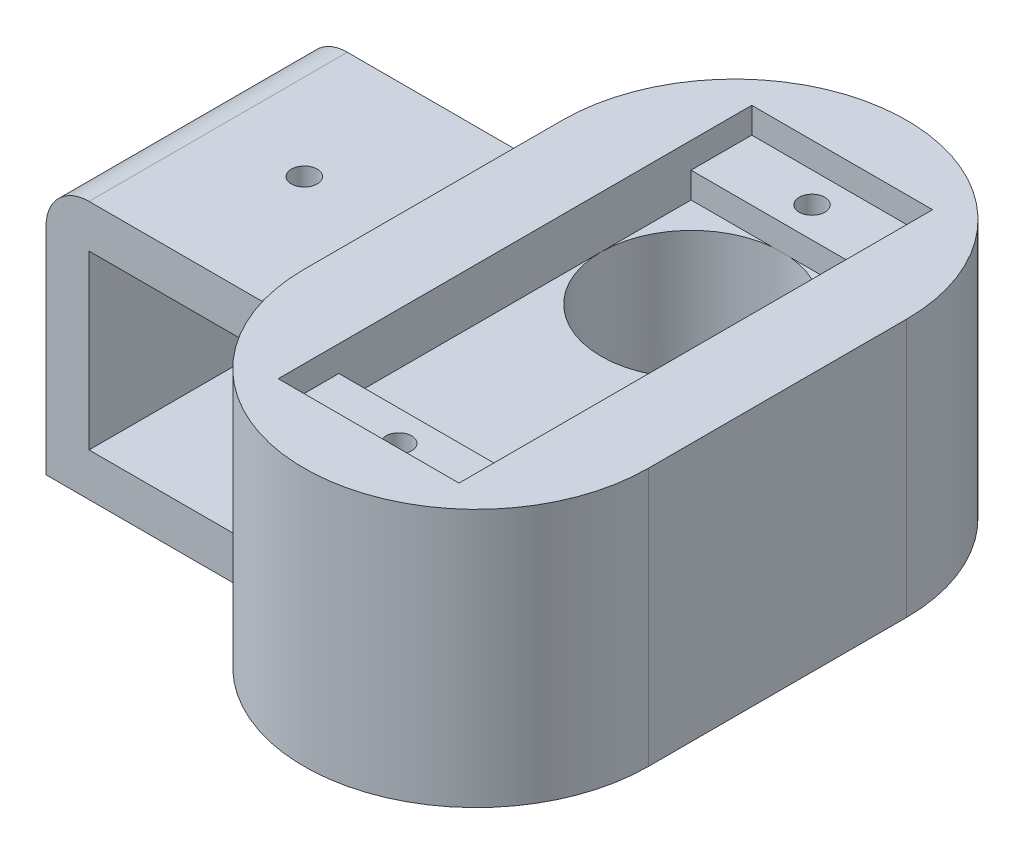
ISO-10303-21;
HEADER;
FILE_DESCRIPTION(('STEP AP214'),'2;1');
FILE_NAME('part.step','',(''),(''),'','','');
FILE_SCHEMA(('AUTOMOTIVE_DESIGN { 1 0 10303 214 1 1 1 1 }'));
ENDSEC;
DATA;
#1=APPLICATION_CONTEXT('core data for automotive mechanical design processes');
#2=APPLICATION_PROTOCOL_DEFINITION('international standard','automotive_design',2000,#1);
#3=PRODUCT_CONTEXT('',#1,'mechanical');
#4=PRODUCT('Part','Part','',(#3));
#5=PRODUCT_RELATED_PRODUCT_CATEGORY('part','',(#4));
#6=PRODUCT_DEFINITION_FORMATION('','',#4);
#7=PRODUCT_DEFINITION_CONTEXT('part definition',#1,'design');
#8=PRODUCT_DEFINITION('design','',#6,#7);
#9=PRODUCT_DEFINITION_SHAPE('','',#8);
#10=(LENGTH_UNIT() NAMED_UNIT(*) SI_UNIT(.MILLI.,.METRE.));
#11=(NAMED_UNIT(*) PLANE_ANGLE_UNIT() SI_UNIT($,.RADIAN.));
#12=(NAMED_UNIT(*) SI_UNIT($,.STERADIAN.) SOLID_ANGLE_UNIT());
#13=UNCERTAINTY_MEASURE_WITH_UNIT(LENGTH_MEASURE(1.E-05),#10,'distance_accuracy_value','');
#14=(GEOMETRIC_REPRESENTATION_CONTEXT(3) GLOBAL_UNCERTAINTY_ASSIGNED_CONTEXT((#13)) GLOBAL_UNIT_ASSIGNED_CONTEXT((#10,
#11,#12)) REPRESENTATION_CONTEXT('',''));
#15=CARTESIAN_POINT('',(0.,0.,0.));
#16=DIRECTION('',(0.,0.,1.));
#17=DIRECTION('',(1.,0.,0.));
#18=AXIS2_PLACEMENT_3D('',#15,#16,#17);
#19=CARTESIAN_POINT('',(35.,-15.,5.03094143416262));
#20=DIRECTION('',(0.,1.,0.));
#21=DIRECTION('',(0.,0.,1.));
#22=AXIS2_PLACEMENT_3D('',#19,#20,#21);
#23=CYLINDRICAL_SURFACE('',#22,10.5);
#24=CARTESIAN_POINT('',(35.,14.68,5.03094143416262));
#25=DIRECTION('',(0.,1.,0.));
#26=DIRECTION('',(0.,0.,1.));
#27=AXIS2_PLACEMENT_3D('',#24,#25,#26);
#28=CIRCLE('',#27,10.5);
#29=CARTESIAN_POINT('',(45.5,14.68,5.03094143416262));
#30=VERTEX_POINT('',#29);
#31=CARTESIAN_POINT('',(36.023474474523,14.68,-5.41905856583738));
#32=VERTEX_POINT('',#31);
#33=EDGE_CURVE('E215',#30,#32,#28,.T.);
#34=ORIENTED_EDGE('',*,*,#33,.T.);
#35=CARTESIAN_POINT('',(33.976525525477,14.68,-5.41905856583738));
#36=VERTEX_POINT('',#35);
#37=EDGE_CURVE('E235',#32,#36,#28,.T.);
#38=ORIENTED_EDGE('',*,*,#37,.T.);
#39=CARTESIAN_POINT('',(24.5,14.68,5.03094143416262));
#40=VERTEX_POINT('',#39);
#41=EDGE_CURVE('E218',#36,#40,#28,.T.);
#42=ORIENTED_EDGE('',*,*,#41,.T.);
#43=EDGE_CURVE('E211',#40,#30,#28,.T.);
#44=ORIENTED_EDGE('',*,*,#43,.T.);
#45=EDGE_LOOP('',(#34,#38,#42,#44));
#46=FACE_BOUND('',#45,.T.);
#47=CARTESIAN_POINT('',(35.,0.68,5.03094143416262));
#48=DIRECTION('',(0.,-1.,0.));
#49=DIRECTION('',(0.,0.,-1.));
#50=AXIS2_PLACEMENT_3D('',#47,#48,#49);
#51=CIRCLE('',#50,10.5);
#52=CARTESIAN_POINT('',(35.,0.68,-5.46905856583738));
#53=VERTEX_POINT('',#52);
#54=EDGE_CURVE('E462',#53,#53,#51,.F.);
#55=ORIENTED_EDGE('',*,*,#54,.F.);
#56=EDGE_LOOP('',(#55));
#57=FACE_BOUND('',#56,.T.);
#58=ADVANCED_FACE('F43',(#46,#57),#23,.F.);
#59=CARTESIAN_POINT('',(0.,14.68,0.));
#60=DIRECTION('',(0.,-1.,0.));
#61=DIRECTION('',(0.,0.,-1.));
#62=AXIS2_PLACEMENT_3D('',#59,#60,#61);
#63=PLANE('',#62);
#64=ORIENTED_EDGE('',*,*,#33,.F.);
#65=DIRECTION('',(0.,0.,-1.));
#66=VECTOR('',#65,1.);
#67=CARTESIAN_POINT('',(45.5,14.68,35.4809414341626));
#68=LINE('',#67,#66);
#69=CARTESIAN_POINT('',(45.5,14.68,-5.41905856583738));
#70=VERTEX_POINT('',#69);
#71=EDGE_CURVE('E229',#30,#70,#68,.T.);
#72=ORIENTED_EDGE('',*,*,#71,.T.);
#73=DIRECTION('',(-1.,0.,0.));
#74=VECTOR('',#73,1.);
#75=CARTESIAN_POINT('',(24.5,14.68,-5.41905856583738));
#76=LINE('',#75,#74);
#77=EDGE_CURVE('E232',#70,#32,#76,.T.);
#78=ORIENTED_EDGE('',*,*,#77,.T.);
#79=EDGE_LOOP('',(#64,#72,#78));
#80=FACE_BOUND('',#79,.T.);
#81=ADVANCED_FACE('F228',(#80),#63,.F.);
#82=ORIENTED_EDGE('',*,*,#41,.F.);
#83=CARTESIAN_POINT('',(24.5,14.68,-5.41905856583738));
#84=VERTEX_POINT('',#83);
#85=EDGE_CURVE('E250',#36,#84,#76,.T.);
#86=ORIENTED_EDGE('',*,*,#85,.T.);
#87=DIRECTION('',(0.,0.,1.));
#88=VECTOR('',#87,1.);
#89=CARTESIAN_POINT('',(24.5,14.68,35.4809414341626));
#90=LINE('',#89,#88);
#91=EDGE_CURVE('E258',#84,#40,#90,.T.);
#92=ORIENTED_EDGE('',*,*,#91,.T.);
#93=EDGE_LOOP('',(#82,#86,#92));
#94=FACE_BOUND('',#93,.T.);
#95=ADVANCED_FACE('F518',(#94),#63,.F.);
#96=CARTESIAN_POINT('',(0.,17.68,0.));
#97=DIRECTION('',(0.,-1.,0.));
#98=DIRECTION('',(0.,0.,-1.));
#99=AXIS2_PLACEMENT_3D('',#96,#97,#98);
#100=PLANE('',#99);
#101=CARTESIAN_POINT('',(35.,17.68,39.0309414341626));
#102=DIRECTION('',(0.,1.,0.));
#103=DIRECTION('',(0.,0.,1.));
#104=AXIS2_PLACEMENT_3D('',#101,#102,#103);
#105=CIRCLE('',#104,1.5);
#106=CARTESIAN_POINT('',(35.,17.68,40.5309414341626));
#107=VERTEX_POINT('',#106);
#108=EDGE_CURVE('E287',#107,#107,#105,.T.);
#109=ORIENTED_EDGE('',*,*,#108,.F.);
#110=EDGE_LOOP('',(#109));
#111=FACE_BOUND('',#110,.T.);
#112=DIRECTION('',(0.,0.,-1.));
#113=VECTOR('',#112,1.);
#114=CARTESIAN_POINT('',(45.5,17.68,42.5309414341626));
#115=LINE('',#114,#113);
#116=CARTESIAN_POINT('',(45.5,17.68,42.5309414341626));
#117=VERTEX_POINT('',#116);
#118=CARTESIAN_POINT('',(45.5,17.68,35.4809414341626));
#119=VERTEX_POINT('',#118);
#120=EDGE_CURVE('E298',#117,#119,#115,.T.);
#121=ORIENTED_EDGE('',*,*,#120,.T.);
#122=DIRECTION('',(1.,0.,0.));
#123=VECTOR('',#122,1.);
#124=CARTESIAN_POINT('',(24.5,17.68,35.4809414341626));
#125=LINE('',#124,#123);
#126=CARTESIAN_POINT('',(24.5,17.68,35.4809414341626));
#127=VERTEX_POINT('',#126);
#128=EDGE_CURVE('E244',#127,#119,#125,.T.);
#129=ORIENTED_EDGE('',*,*,#128,.F.);
#130=DIRECTION('',(0.,0.,1.));
#131=VECTOR('',#130,1.);
#132=CARTESIAN_POINT('',(24.5,17.68,42.5309414341626));
#133=LINE('',#132,#131);
#134=CARTESIAN_POINT('',(24.5,17.68,42.5309414341626));
#135=VERTEX_POINT('',#134);
#136=EDGE_CURVE('E307',#127,#135,#133,.T.);
#137=ORIENTED_EDGE('',*,*,#136,.T.);
#138=DIRECTION('',(1.,0.,0.));
#139=VECTOR('',#138,1.);
#140=CARTESIAN_POINT('',(24.5,17.68,42.5309414341626));
#141=LINE('',#140,#139);
#142=EDGE_CURVE('E312',#135,#117,#141,.T.);
#143=ORIENTED_EDGE('',*,*,#142,.T.);
#144=EDGE_LOOP('',(#121,#129,#137,#143));
#145=FACE_BOUND('',#144,.T.);
#146=ADVANCED_FACE('F536',(#111,#145),#100,.F.);
#147=CARTESIAN_POINT('',(0.,10.,30.));
#148=DIRECTION('',(0.,1.,0.));
#149=DIRECTION('',(0.,0.,1.));
#150=AXIS2_PLACEMENT_3D('',#147,#148,#149);
#151=PLANE('',#150);
#152=CARTESIAN_POINT('',(0.,10.,15.));
#153=DIRECTION('',(0.,1.,0.));
#154=DIRECTION('',(0.,0.,1.));
#155=AXIS2_PLACEMENT_3D('',#152,#153,#154);
#156=CIRCLE('',#155,1.5);
#157=CARTESIAN_POINT('',(0.,10.,16.5));
#158=VERTEX_POINT('',#157);
#159=EDGE_CURVE('E946',#158,#158,#156,.T.);
#160=ORIENTED_EDGE('',*,*,#159,.T.);
#161=EDGE_LOOP('',(#160));
#162=FACE_BOUND('',#161,.T.);
#163=DIRECTION('',(1.,0.,0.));
#164=VECTOR('',#163,1.);
#165=CARTESIAN_POINT('',(0.,10.,0.));
#166=LINE('',#165,#164);
#167=CARTESIAN_POINT('',(-10.,10.,0.));
#168=VERTEX_POINT('',#167);
#169=CARTESIAN_POINT('',(10.,10.,0.));
#170=VERTEX_POINT('',#169);
#171=EDGE_CURVE('E432',#168,#170,#166,.T.);
#172=ORIENTED_EDGE('',*,*,#171,.T.);
#173=DIRECTION('',(0.,0.,-1.));
#174=VECTOR('',#173,1.);
#175=CARTESIAN_POINT('',(10.,10.,30.));
#176=LINE('',#175,#174);
#177=CARTESIAN_POINT('',(10.,10.,30.));
#178=VERTEX_POINT('',#177);
#179=EDGE_CURVE('E458',#178,#170,#176,.T.);
#180=ORIENTED_EDGE('',*,*,#179,.F.);
#181=DIRECTION('',(1.,0.,0.));
#182=VECTOR('',#181,1.);
#183=CARTESIAN_POINT('',(0.,10.,30.));
#184=LINE('',#183,#182);
#185=CARTESIAN_POINT('',(-10.,10.,30.));
#186=VERTEX_POINT('',#185);
#187=EDGE_CURVE('E403',#186,#178,#184,.T.);
#188=ORIENTED_EDGE('',*,*,#187,.F.);
#189=DIRECTION('',(0.,0.,-1.));
#190=VECTOR('',#189,1.);
#191=CARTESIAN_POINT('',(-10.,10.,30.));
#192=LINE('',#191,#190);
#193=EDGE_CURVE('E448',#186,#168,#192,.T.);
#194=ORIENTED_EDGE('',*,*,#193,.T.);
#195=EDGE_LOOP('',(#172,#180,#188,#194));
#196=FACE_BOUND('',#195,.T.);
#197=ADVANCED_FACE('F567',(#162,#196),#151,.F.);
#198=CARTESIAN_POINT('',(10.,0.,30.));
#199=DIRECTION('',(1.,0.,0.));
#200=DIRECTION('',(0.,0.,-1.));
#201=AXIS2_PLACEMENT_3D('',#198,#199,#200);
#202=PLANE('',#201);
#203=DIRECTION('',(0.,-1.,0.));
#204=VECTOR('',#203,1.);
#205=CARTESIAN_POINT('',(10.,0.,0.));
#206=LINE('',#205,#204);
#207=CARTESIAN_POINT('',(10.,-10.,0.));
#208=VERTEX_POINT('',#207);
#209=EDGE_CURVE('E436',#170,#208,#206,.T.);
#210=ORIENTED_EDGE('',*,*,#209,.T.);
#211=DIRECTION('',(0.,0.,-1.));
#212=VECTOR('',#211,1.);
#213=CARTESIAN_POINT('',(10.,-10.,30.));
#214=LINE('',#213,#212);
#215=CARTESIAN_POINT('',(10.,-10.,30.));
#216=VERTEX_POINT('',#215);
#217=EDGE_CURVE('E455',#216,#208,#214,.T.);
#218=ORIENTED_EDGE('',*,*,#217,.F.);
#219=DIRECTION('',(0.,-1.,0.));
#220=VECTOR('',#219,1.);
#221=CARTESIAN_POINT('',(10.,0.,30.));
#222=LINE('',#221,#220);
#223=EDGE_CURVE('E407',#178,#216,#222,.T.);
#224=ORIENTED_EDGE('',*,*,#223,.F.);
#225=ORIENTED_EDGE('',*,*,#179,.T.);
#226=EDGE_LOOP('',(#210,#218,#224,#225));
#227=FACE_BOUND('',#226,.T.);
#228=ADVANCED_FACE('F824',(#227),#202,.F.);
#229=CARTESIAN_POINT('',(0.,-10.,30.));
#230=DIRECTION('',(0.,1.,0.));
#231=DIRECTION('',(0.,0.,1.));
#232=AXIS2_PLACEMENT_3D('',#229,#230,#231);
#233=PLANE('',#232);
#234=CARTESIAN_POINT('',(0.,-10.,15.));
#235=DIRECTION('',(0.,1.,0.));
#236=DIRECTION('',(0.,0.,1.));
#237=AXIS2_PLACEMENT_3D('',#234,#235,#236);
#238=CIRCLE('',#237,1.5);
#239=CARTESIAN_POINT('',(0.,-10.,16.5));
#240=VERTEX_POINT('',#239);
#241=EDGE_CURVE('E952',#240,#240,#238,.T.);
#242=ORIENTED_EDGE('',*,*,#241,.F.);
#243=EDGE_LOOP('',(#242));
#244=FACE_BOUND('',#243,.T.);
#245=DIRECTION('',(1.,0.,0.));
#246=VECTOR('',#245,1.);
#247=CARTESIAN_POINT('',(0.,-10.,0.));
#248=LINE('',#247,#246);
#249=CARTESIAN_POINT('',(-10.,-10.,0.));
#250=VERTEX_POINT('',#249);
#251=EDGE_CURVE('E440',#250,#208,#248,.T.);
#252=ORIENTED_EDGE('',*,*,#251,.F.);
#253=DIRECTION('',(0.,0.,-1.));
#254=VECTOR('',#253,1.);
#255=CARTESIAN_POINT('',(-10.,-10.,30.));
#256=LINE('',#255,#254);
#257=CARTESIAN_POINT('',(-10.,-10.,30.));
#258=VERTEX_POINT('',#257);
#259=EDGE_CURVE('E451',#258,#250,#256,.T.);
#260=ORIENTED_EDGE('',*,*,#259,.F.);
#261=DIRECTION('',(1.,0.,0.));
#262=VECTOR('',#261,1.);
#263=CARTESIAN_POINT('',(0.,-10.,30.));
#264=LINE('',#263,#262);
#265=EDGE_CURVE('E410',#258,#216,#264,.T.);
#266=ORIENTED_EDGE('',*,*,#265,.T.);
#267=ORIENTED_EDGE('',*,*,#217,.T.);
#268=EDGE_LOOP('',(#252,#260,#266,#267));
#269=FACE_BOUND('',#268,.T.);
#270=ADVANCED_FACE('F828',(#244,#269),#233,.T.);
#271=CARTESIAN_POINT('',(15.,0.,30.));
#272=DIRECTION('',(1.,0.,0.));
#273=DIRECTION('',(0.,1.,0.));
#274=AXIS2_PLACEMENT_3D('',#271,#272,#273);
#275=PLANE('',#274);
#276=DIRECTION('',(0.,1.,0.));
#277=VECTOR('',#276,1.);
#278=CARTESIAN_POINT('',(15.,-9.32,0.0309414341626291));
#279=LINE('',#278,#277);
#280=CARTESIAN_POINT('',(15.,-9.32,0.0309414341626291));
#281=VERTEX_POINT('',#280);
#282=CARTESIAN_POINT('',(15.,20.,0.0309414341626291));
#283=VERTEX_POINT('',#282);
#284=EDGE_CURVE('E59',#281,#283,#279,.T.);
#285=ORIENTED_EDGE('',*,*,#284,.F.);
#286=DIRECTION('',(0.,0.,1.));
#287=VECTOR('',#286,1.);
#288=CARTESIAN_POINT('',(15.,-9.32,30.0309414341626));
#289=LINE('',#288,#287);
#290=CARTESIAN_POINT('',(15.,-9.32,30.));
#291=VERTEX_POINT('',#290);
#292=EDGE_CURVE('E357',#281,#291,#289,.T.);
#293=ORIENTED_EDGE('',*,*,#292,.T.);
#294=DIRECTION('',(0.,-1.,0.));
#295=VECTOR('',#294,1.);
#296=CARTESIAN_POINT('',(15.,0.,30.));
#297=LINE('',#296,#295);
#298=CARTESIAN_POINT('',(15.,-15.,30.));
#299=VERTEX_POINT('',#298);
#300=EDGE_CURVE('E392',#291,#299,#297,.T.);
#301=ORIENTED_EDGE('',*,*,#300,.T.);
#302=DIRECTION('',(0.,0.,-1.));
#303=VECTOR('',#302,1.);
#304=CARTESIAN_POINT('',(15.,-15.,30.));
#305=LINE('',#304,#303);
#306=CARTESIAN_POINT('',(15.,-15.,0.));
#307=VERTEX_POINT('',#306);
#308=EDGE_CURVE('E418',#299,#307,#305,.T.);
#309=ORIENTED_EDGE('',*,*,#308,.T.);
#310=DIRECTION('',(0.,-1.,0.));
#311=VECTOR('',#310,1.);
#312=CARTESIAN_POINT('',(15.,0.,0.));
#313=LINE('',#312,#311);
#314=CARTESIAN_POINT('',(15.,19.9999964985809,0.));
#315=VERTEX_POINT('',#314);
#316=EDGE_CURVE('E67',#315,#307,#313,.T.);
#317=ORIENTED_EDGE('',*,*,#316,.F.);
#318=DIRECTION('',(0.,0.,1.));
#319=VECTOR('',#318,1.);
#320=CARTESIAN_POINT('',(15.,20.,0.0154707170813145));
#321=LINE('',#320,#319);
#322=EDGE_CURVE('E52',#315,#283,#321,.T.);
#323=ORIENTED_EDGE('',*,*,#322,.T.);
#324=EDGE_LOOP('',(#285,#293,#301,#309,#317,#323));
#325=FACE_BOUND('',#324,.T.);
#326=ADVANCED_FACE('F497',(#325),#275,.T.);
#327=CARTESIAN_POINT('',(0.,15.,30.));
#328=DIRECTION('',(0.,1.,0.));
#329=DIRECTION('',(0.,0.,1.));
#330=AXIS2_PLACEMENT_3D('',#327,#328,#329);
#331=PLANE('',#330);
#332=CARTESIAN_POINT('',(0.,15.,15.));
#333=DIRECTION('',(0.,1.,0.));
#334=DIRECTION('',(0.,0.,1.));
#335=AXIS2_PLACEMENT_3D('',#332,#333,#334);
#336=CIRCLE('',#335,1.5);
#337=CARTESIAN_POINT('',(0.,15.,16.5));
#338=VERTEX_POINT('',#337);
#339=EDGE_CURVE('E959',#338,#338,#336,.T.);
#340=ORIENTED_EDGE('',*,*,#339,.F.);
#341=EDGE_LOOP('',(#340));
#342=FACE_BOUND('',#341,.T.);
#343=DIRECTION('',(1.,0.,0.));
#344=VECTOR('',#343,1.);
#345=CARTESIAN_POINT('',(0.,15.,0.));
#346=LINE('',#345,#344);
#347=CARTESIAN_POINT('',(-10.,15.,0.));
#348=VERTEX_POINT('',#347);
#349=CARTESIAN_POINT('',(10.,15.,0.));
#350=VERTEX_POINT('',#349);
#351=EDGE_CURVE('E421',#348,#350,#346,.T.);
#352=ORIENTED_EDGE('',*,*,#351,.F.);
#353=DIRECTION('',(0.,0.,-1.));
#354=VECTOR('',#353,1.);
#355=CARTESIAN_POINT('',(-10.,15.,30.));
#356=LINE('',#355,#354);
#357=CARTESIAN_POINT('',(-10.,15.,30.));
#358=VERTEX_POINT('',#357);
#359=EDGE_CURVE('E482',#348,#358,#356,.F.);
#360=ORIENTED_EDGE('',*,*,#359,.T.);
#361=DIRECTION('',(1.,0.,0.));
#362=VECTOR('',#361,1.);
#363=CARTESIAN_POINT('',(0.,15.,30.));
#364=LINE('',#363,#362);
#365=CARTESIAN_POINT('',(10.,15.,30.));
#366=VERTEX_POINT('',#365);
#367=EDGE_CURVE('E391',#358,#366,#364,.T.);
#368=ORIENTED_EDGE('',*,*,#367,.T.);
#369=DIRECTION('',(0.,0.,-1.));
#370=VECTOR('',#369,1.);
#371=CARTESIAN_POINT('',(10.,15.,0.0309414341626291));
#372=LINE('',#371,#370);
#373=EDGE_CURVE('E478',#366,#350,#372,.T.);
#374=ORIENTED_EDGE('',*,*,#373,.T.);
#375=EDGE_LOOP('',(#352,#360,#368,#374));
#376=FACE_BOUND('',#375,.T.);
#377=ADVANCED_FACE('F848',(#342,#376),#331,.T.);
#378=CARTESIAN_POINT('',(-15.,0.,30.));
#379=DIRECTION('',(1.,0.,0.));
#380=DIRECTION('',(0.,0.,-1.));
#381=AXIS2_PLACEMENT_3D('',#378,#379,#380);
#382=PLANE('',#381);
#383=DIRECTION('',(0.,-1.,0.));
#384=VECTOR('',#383,1.);
#385=CARTESIAN_POINT('',(-15.,0.,30.));
#386=LINE('',#385,#384);
#387=CARTESIAN_POINT('',(-15.,10.,30.));
#388=VERTEX_POINT('',#387);
#389=CARTESIAN_POINT('',(-15.,-15.,30.));
#390=VERTEX_POINT('',#389);
#391=EDGE_CURVE('E396',#388,#390,#386,.T.);
#392=ORIENTED_EDGE('',*,*,#391,.F.);
#393=DIRECTION('',(0.,0.,-1.));
#394=VECTOR('',#393,1.);
#395=CARTESIAN_POINT('',(-15.,10.,0.));
#396=LINE('',#395,#394);
#397=CARTESIAN_POINT('',(-15.,10.,0.));
#398=VERTEX_POINT('',#397);
#399=EDGE_CURVE('E471',#388,#398,#396,.T.);
#400=ORIENTED_EDGE('',*,*,#399,.T.);
#401=DIRECTION('',(0.,-1.,0.));
#402=VECTOR('',#401,1.);
#403=CARTESIAN_POINT('',(-15.,0.,0.));
#404=LINE('',#403,#402);
#405=CARTESIAN_POINT('',(-15.,-15.,0.));
#406=VERTEX_POINT('',#405);
#407=EDGE_CURVE('E425',#398,#406,#404,.T.);
#408=ORIENTED_EDGE('',*,*,#407,.T.);
#409=DIRECTION('',(0.,0.,-1.));
#410=VECTOR('',#409,1.);
#411=CARTESIAN_POINT('',(-15.,-15.,30.));
#412=LINE('',#411,#410);
#413=EDGE_CURVE('E452',#390,#406,#412,.T.);
#414=ORIENTED_EDGE('',*,*,#413,.F.);
#415=EDGE_LOOP('',(#392,#400,#408,#414));
#416=FACE_BOUND('',#415,.T.);
#417=ADVANCED_FACE('F855',(#416),#382,.F.);
#418=CARTESIAN_POINT('',(0.,-15.,30.));
#419=DIRECTION('',(0.,1.,0.));
#420=DIRECTION('',(0.,0.,1.));
#421=AXIS2_PLACEMENT_3D('',#418,#419,#420);
#422=PLANE('',#421);
#423=CARTESIAN_POINT('',(0.,-15.,15.));
#424=DIRECTION('',(0.,1.,0.));
#425=DIRECTION('',(0.,0.,1.));
#426=AXIS2_PLACEMENT_3D('',#423,#424,#425);
#427=CIRCLE('',#426,1.5);
#428=CARTESIAN_POINT('',(0.,-15.,16.5));
#429=VERTEX_POINT('',#428);
#430=EDGE_CURVE('E958',#429,#429,#427,.T.);
#431=ORIENTED_EDGE('',*,*,#430,.T.);
#432=EDGE_LOOP('',(#431));
#433=FACE_BOUND('',#432,.T.);
#434=DIRECTION('',(1.,0.,0.));
#435=VECTOR('',#434,1.);
#436=CARTESIAN_POINT('',(0.,-15.,0.));
#437=LINE('',#436,#435);
#438=EDGE_CURVE('E428',#406,#307,#437,.T.);
#439=ORIENTED_EDGE('',*,*,#438,.T.);
#440=ORIENTED_EDGE('',*,*,#308,.F.);
#441=DIRECTION('',(1.,0.,0.));
#442=VECTOR('',#441,1.);
#443=CARTESIAN_POINT('',(0.,-15.,30.));
#444=LINE('',#443,#442);
#445=EDGE_CURVE('E399',#390,#299,#444,.T.);
#446=ORIENTED_EDGE('',*,*,#445,.F.);
#447=ORIENTED_EDGE('',*,*,#413,.T.);
#448=EDGE_LOOP('',(#439,#440,#446,#447));
#449=FACE_BOUND('',#448,.T.);
#450=ADVANCED_FACE('F814',(#433,#449),#422,.F.);
#451=CARTESIAN_POINT('',(-10.,0.,30.));
#452=DIRECTION('',(1.,0.,0.));
#453=DIRECTION('',(0.,1.,0.));
#454=AXIS2_PLACEMENT_3D('',#451,#452,#453);
#455=PLANE('',#454);
#456=DIRECTION('',(0.,-1.,0.));
#457=VECTOR('',#456,1.);
#458=CARTESIAN_POINT('',(-10.,0.,0.));
#459=LINE('',#458,#457);
#460=EDGE_CURVE('E444',#168,#250,#459,.T.);
#461=ORIENTED_EDGE('',*,*,#460,.F.);
#462=ORIENTED_EDGE('',*,*,#193,.F.);
#463=DIRECTION('',(0.,-1.,0.));
#464=VECTOR('',#463,1.);
#465=CARTESIAN_POINT('',(-10.,0.,30.));
#466=LINE('',#465,#464);
#467=EDGE_CURVE('E414',#186,#258,#466,.T.);
#468=ORIENTED_EDGE('',*,*,#467,.T.);
#469=ORIENTED_EDGE('',*,*,#259,.T.);
#470=EDGE_LOOP('',(#461,#462,#468,#469));
#471=FACE_BOUND('',#470,.T.);
#472=ADVANCED_FACE('F808',(#471),#455,.T.);
#473=CARTESIAN_POINT('',(0.,0.,30.));
#474=DIRECTION('',(0.,0.,1.));
#475=DIRECTION('',(1.,0.,0.));
#476=AXIS2_PLACEMENT_3D('',#473,#474,#475);
#477=PLANE('',#476);
#478=ORIENTED_EDGE('',*,*,#367,.F.);
#479=CARTESIAN_POINT('',(-10.,10.,30.));
#480=DIRECTION('',(0.,0.,1.));
#481=DIRECTION('',(1.,0.,0.));
#482=AXIS2_PLACEMENT_3D('',#479,#480,#481);
#483=CIRCLE('',#482,5.);
#484=EDGE_CURVE('E485',#358,#388,#483,.T.);
#485=ORIENTED_EDGE('',*,*,#484,.T.);
#486=ORIENTED_EDGE('',*,*,#391,.T.);
#487=ORIENTED_EDGE('',*,*,#445,.T.);
#488=ORIENTED_EDGE('',*,*,#300,.F.);
#489=CARTESIAN_POINT('',(15.,20.,30.));
#490=VERTEX_POINT('',#489);
#491=EDGE_CURVE('E387',#490,#291,#297,.T.);
#492=ORIENTED_EDGE('',*,*,#491,.F.);
#493=CARTESIAN_POINT('',(10.,20.,30.));
#494=DIRECTION('',(0.,0.,1.));
#495=DIRECTION('',(1.,0.,0.));
#496=AXIS2_PLACEMENT_3D('',#493,#494,#495);
#497=CIRCLE('',#496,5.);
#498=EDGE_CURVE('E11',#490,#366,#497,.F.);
#499=ORIENTED_EDGE('',*,*,#498,.T.);
#500=EDGE_LOOP('',(#478,#485,#486,#487,#488,#492,#499));
#501=FACE_BOUND('',#500,.T.);
#502=ORIENTED_EDGE('',*,*,#187,.T.);
#503=ORIENTED_EDGE('',*,*,#223,.T.);
#504=ORIENTED_EDGE('',*,*,#265,.F.);
#505=ORIENTED_EDGE('',*,*,#467,.F.);
#506=EDGE_LOOP('',(#502,#503,#504,#505));
#507=FACE_BOUND('',#506,.T.);
#508=ADVANCED_FACE('F813',(#501,#507),#477,.T.);
#509=CARTESIAN_POINT('',(0.,0.,0.));
#510=DIRECTION('',(0.,0.,1.));
#511=DIRECTION('',(1.,0.,0.));
#512=AXIS2_PLACEMENT_3D('',#509,#510,#511);
#513=PLANE('',#512);
#514=ORIENTED_EDGE('',*,*,#407,.F.);
#515=CARTESIAN_POINT('',(-10.,10.,0.));
#516=DIRECTION('',(0.,0.,1.));
#517=DIRECTION('',(1.,0.,0.));
#518=AXIS2_PLACEMENT_3D('',#515,#516,#517);
#519=CIRCLE('',#518,5.);
#520=EDGE_CURVE('E475',#398,#348,#519,.F.);
#521=ORIENTED_EDGE('',*,*,#520,.T.);
#522=ORIENTED_EDGE('',*,*,#351,.T.);
#523=CARTESIAN_POINT('',(10.,20.,0.));
#524=DIRECTION('',(0.,0.,1.));
#525=DIRECTION('',(1.,0.,0.));
#526=AXIS2_PLACEMENT_3D('',#523,#524,#525);
#527=CIRCLE('',#526,5.);
#528=EDGE_CURVE('E492',#350,#315,#527,.T.);
#529=ORIENTED_EDGE('',*,*,#528,.T.);
#530=ORIENTED_EDGE('',*,*,#316,.T.);
#531=ORIENTED_EDGE('',*,*,#438,.F.);
#532=EDGE_LOOP('',(#514,#521,#522,#529,#530,#531));
#533=FACE_BOUND('',#532,.T.);
#534=ORIENTED_EDGE('',*,*,#171,.F.);
#535=ORIENTED_EDGE('',*,*,#460,.T.);
#536=ORIENTED_EDGE('',*,*,#251,.T.);
#537=ORIENTED_EDGE('',*,*,#209,.F.);
#538=EDGE_LOOP('',(#534,#535,#536,#537));
#539=FACE_BOUND('',#538,.T.);
#540=ADVANCED_FACE('F798',(#533,#539),#513,.F.);
#541=CARTESIAN_POINT('',(35.,-9.32,30.0309414341626));
#542=DIRECTION('',(0.,1.,0.));
#543=DIRECTION('',(0.,0.,1.));
#544=AXIS2_PLACEMENT_3D('',#541,#542,#543);
#545=CYLINDRICAL_SURFACE('',#544,20.);
#546=CARTESIAN_POINT('',(35.,20.68,30.0309414341626));
#547=DIRECTION('',(0.,1.,0.));
#548=DIRECTION('',(0.,0.,1.));
#549=AXIS2_PLACEMENT_3D('',#546,#547,#548);
#550=CIRCLE('',#549,20.);
#551=CARTESIAN_POINT('',(15.,20.68,30.0309414341626));
#552=VERTEX_POINT('',#551);
#553=CARTESIAN_POINT('',(55.,20.68,30.0309414341626));
#554=VERTEX_POINT('',#553);
#555=EDGE_CURVE('E334',#552,#554,#550,.T.);
#556=ORIENTED_EDGE('',*,*,#555,.F.);
#557=DIRECTION('',(0.,1.,0.));
#558=VECTOR('',#557,1.);
#559=CARTESIAN_POINT('',(15.,-9.32,30.0309414341626));
#560=LINE('',#559,#558);
#561=CARTESIAN_POINT('',(15.,-9.32,30.0309414341626));
#562=VERTEX_POINT('',#561);
#563=EDGE_CURVE('E376',#562,#552,#560,.T.);
#564=ORIENTED_EDGE('',*,*,#563,.F.);
#565=CARTESIAN_POINT('',(35.,-9.32,30.0309414341626));
#566=DIRECTION('',(0.,1.,0.));
#567=DIRECTION('',(0.,0.,1.));
#568=AXIS2_PLACEMENT_3D('',#565,#566,#567);
#569=CIRCLE('',#568,20.);
#570=CARTESIAN_POINT('',(55.,-9.32,30.0309414341626));
#571=VERTEX_POINT('',#570);
#572=EDGE_CURVE('E344',#562,#571,#569,.T.);
#573=ORIENTED_EDGE('',*,*,#572,.T.);
#574=DIRECTION('',(0.,1.,0.));
#575=VECTOR('',#574,1.);
#576=CARTESIAN_POINT('',(55.,-9.32,30.0309414341626));
#577=LINE('',#576,#575);
#578=EDGE_CURVE('E361',#571,#554,#577,.T.);
#579=ORIENTED_EDGE('',*,*,#578,.T.);
#580=EDGE_LOOP('',(#556,#564,#573,#579));
#581=FACE_BOUND('',#580,.T.);
#582=ADVANCED_FACE('F793',(#581),#545,.T.);
#583=CARTESIAN_POINT('',(15.,-9.32,30.0309414341626));
#584=DIRECTION('',(-1.,0.,0.));
#585=DIRECTION('',(0.,0.,1.));
#586=AXIS2_PLACEMENT_3D('',#583,#584,#585);
#587=PLANE('',#586);
#588=CARTESIAN_POINT('',(15.,20.68,0.0309414341626291));
#589=VERTEX_POINT('',#588);
#590=EDGE_CURVE('E381',#283,#589,#279,.T.);
#591=ORIENTED_EDGE('',*,*,#590,.F.);
#592=DIRECTION('',(0.,0.,-1.));
#593=VECTOR('',#592,1.);
#594=CARTESIAN_POINT('',(15.,20.,30.));
#595=LINE('',#594,#593);
#596=EDGE_CURVE('E488',#283,#490,#595,.F.);
#597=ORIENTED_EDGE('',*,*,#596,.T.);
#598=ORIENTED_EDGE('',*,*,#491,.T.);
#599=EDGE_CURVE('E356',#291,#562,#289,.T.);
#600=ORIENTED_EDGE('',*,*,#599,.T.);
#601=ORIENTED_EDGE('',*,*,#563,.T.);
#602=DIRECTION('',(0.,0.,1.));
#603=VECTOR('',#602,1.);
#604=CARTESIAN_POINT('',(15.,20.68,30.0309414341626));
#605=LINE('',#604,#603);
#606=EDGE_CURVE('E349',#589,#552,#605,.T.);
#607=ORIENTED_EDGE('',*,*,#606,.F.);
#608=EDGE_LOOP('',(#591,#597,#598,#600,#601,#607));
#609=FACE_BOUND('',#608,.T.);
#610=ADVANCED_FACE('F502',(#609),#587,.T.);
#611=CARTESIAN_POINT('',(35.,-9.32,0.0309414341626291));
#612=DIRECTION('',(0.,1.,0.));
#613=DIRECTION('',(0.,0.,1.));
#614=AXIS2_PLACEMENT_3D('',#611,#612,#613);
#615=CYLINDRICAL_SURFACE('',#614,20.);
#616=CARTESIAN_POINT('',(35.,20.68,0.0309414341626291));
#617=DIRECTION('',(0.,1.,0.));
#618=DIRECTION('',(0.,0.,1.));
#619=AXIS2_PLACEMENT_3D('',#616,#617,#618);
#620=CIRCLE('',#619,20.);
#621=CARTESIAN_POINT('',(55.,20.68,0.0309414341626303));
#622=VERTEX_POINT('',#621);
#623=EDGE_CURVE('E369',#622,#589,#620,.T.);
#624=ORIENTED_EDGE('',*,*,#623,.F.);
#625=DIRECTION('',(0.,1.,0.));
#626=VECTOR('',#625,1.);
#627=CARTESIAN_POINT('',(55.,-9.32,0.0309414341626303));
#628=LINE('',#627,#626);
#629=CARTESIAN_POINT('',(55.,-9.32,0.0309414341626303));
#630=VERTEX_POINT('',#629);
#631=EDGE_CURVE('E382',#630,#622,#628,.T.);
#632=ORIENTED_EDGE('',*,*,#631,.F.);
#633=CARTESIAN_POINT('',(35.,-9.32,0.0309414341626291));
#634=DIRECTION('',(0.,1.,0.));
#635=DIRECTION('',(0.,0.,1.));
#636=AXIS2_PLACEMENT_3D('',#633,#634,#635);
#637=CIRCLE('',#636,20.);
#638=EDGE_CURVE('E353',#630,#281,#637,.T.);
#639=ORIENTED_EDGE('',*,*,#638,.T.);
#640=ORIENTED_EDGE('',*,*,#284,.T.);
#641=ORIENTED_EDGE('',*,*,#590,.T.);
#642=EDGE_LOOP('',(#624,#632,#639,#640,#641));
#643=FACE_BOUND('',#642,.T.);
#644=ADVANCED_FACE('F785',(#643),#615,.T.);
#645=CARTESIAN_POINT('',(55.,-9.32,30.0309414341626));
#646=DIRECTION('',(1.,0.,0.));
#647=DIRECTION('',(0.,0.,-1.));
#648=AXIS2_PLACEMENT_3D('',#645,#646,#647);
#649=PLANE('',#648);
#650=DIRECTION('',(0.,0.,-1.));
#651=VECTOR('',#650,1.);
#652=CARTESIAN_POINT('',(55.,20.68,30.0309414341626));
#653=LINE('',#652,#651);
#654=EDGE_CURVE('E365',#554,#622,#653,.T.);
#655=ORIENTED_EDGE('',*,*,#654,.F.);
#656=ORIENTED_EDGE('',*,*,#578,.F.);
#657=DIRECTION('',(0.,0.,-1.));
#658=VECTOR('',#657,1.);
#659=CARTESIAN_POINT('',(55.,-9.32,30.0309414341626));
#660=LINE('',#659,#658);
#661=EDGE_CURVE('E348',#571,#630,#660,.T.);
#662=ORIENTED_EDGE('',*,*,#661,.T.);
#663=ORIENTED_EDGE('',*,*,#631,.T.);
#664=EDGE_LOOP('',(#655,#656,#662,#663));
#665=FACE_BOUND('',#664,.T.);
#666=ADVANCED_FACE('F695',(#665),#649,.T.);
#667=CARTESIAN_POINT('',(35.,-9.32,30.0309414341626));
#668=DIRECTION('',(0.,1.,0.));
#669=DIRECTION('',(0.,0.,1.));
#670=AXIS2_PLACEMENT_3D('',#667,#668,#669);
#671=PLANE('',#670);
#672=ORIENTED_EDGE('',*,*,#572,.F.);
#673=ORIENTED_EDGE('',*,*,#599,.F.);
#674=ORIENTED_EDGE('',*,*,#292,.F.);
#675=ORIENTED_EDGE('',*,*,#638,.F.);
#676=ORIENTED_EDGE('',*,*,#661,.F.);
#677=EDGE_LOOP('',(#672,#673,#674,#675,#676));
#678=FACE_BOUND('',#677,.T.);
#679=CARTESIAN_POINT('',(35.,-9.32,5.03094143416262));
#680=DIRECTION('',(0.,-1.,0.));
#681=DIRECTION('',(0.,0.,-1.));
#682=AXIS2_PLACEMENT_3D('',#679,#680,#681);
#683=CIRCLE('',#682,4.);
#684=CARTESIAN_POINT('',(35.,-9.32,1.03094143416262));
#685=VERTEX_POINT('',#684);
#686=EDGE_CURVE('E943',#685,#685,#683,.T.);
#687=ORIENTED_EDGE('',*,*,#686,.F.);
#688=EDGE_LOOP('',(#687));
#689=FACE_BOUND('',#688,.T.);
#690=ADVANCED_FACE('F689',(#678,#689),#671,.F.);
#691=CARTESIAN_POINT('',(35.,20.68,30.0309414341626));
#692=DIRECTION('',(0.,1.,0.));
#693=DIRECTION('',(0.,0.,1.));
#694=AXIS2_PLACEMENT_3D('',#691,#692,#693);
#695=PLANE('',#694);
#696=DIRECTION('',(0.,0.,-1.));
#697=VECTOR('',#696,1.);
#698=CARTESIAN_POINT('',(45.5,20.68,42.5309414341626));
#699=LINE('',#698,#697);
#700=CARTESIAN_POINT('',(45.5,20.68,42.5309414341626));
#701=VERTEX_POINT('',#700);
#702=CARTESIAN_POINT('',(45.5,20.68,-12.4690585658374));
#703=VERTEX_POINT('',#702);
#704=EDGE_CURVE('E286',#701,#703,#699,.T.);
#705=ORIENTED_EDGE('',*,*,#704,.F.);
#706=DIRECTION('',(1.,0.,0.));
#707=VECTOR('',#706,1.);
#708=CARTESIAN_POINT('',(24.5,20.68,42.5309414341626));
#709=LINE('',#708,#707);
#710=CARTESIAN_POINT('',(24.5,20.68,42.5309414341626));
#711=VERTEX_POINT('',#710);
#712=EDGE_CURVE('E327',#711,#701,#709,.T.);
#713=ORIENTED_EDGE('',*,*,#712,.F.);
#714=DIRECTION('',(0.,0.,1.));
#715=VECTOR('',#714,1.);
#716=CARTESIAN_POINT('',(24.5,20.68,42.5309414341626));
#717=LINE('',#716,#715);
#718=CARTESIAN_POINT('',(24.5,20.68,-12.4690585658374));
#719=VERTEX_POINT('',#718);
#720=EDGE_CURVE('E323',#719,#711,#717,.T.);
#721=ORIENTED_EDGE('',*,*,#720,.F.);
#722=DIRECTION('',(-1.,0.,0.));
#723=VECTOR('',#722,1.);
#724=CARTESIAN_POINT('',(24.5,20.68,-12.4690585658374));
#725=LINE('',#724,#723);
#726=EDGE_CURVE('E319',#703,#719,#725,.T.);
#727=ORIENTED_EDGE('',*,*,#726,.F.);
#728=EDGE_LOOP('',(#705,#713,#721,#727));
#729=FACE_BOUND('',#728,.T.);
#730=ORIENTED_EDGE('',*,*,#555,.T.);
#731=ORIENTED_EDGE('',*,*,#654,.T.);
#732=ORIENTED_EDGE('',*,*,#623,.T.);
#733=ORIENTED_EDGE('',*,*,#606,.T.);
#734=EDGE_LOOP('',(#730,#731,#732,#733));
#735=FACE_BOUND('',#734,.T.);
#736=ADVANCED_FACE('F544',(#729,#735),#695,.T.);
#737=CARTESIAN_POINT('',(45.5,17.68,42.5309414341626));
#738=DIRECTION('',(1.,0.,0.));
#739=DIRECTION('',(0.,0.,-1.));
#740=AXIS2_PLACEMENT_3D('',#737,#738,#739);
#741=PLANE('',#740);
#742=ORIENTED_EDGE('',*,*,#704,.T.);
#743=DIRECTION('',(0.,1.,0.));
#744=VECTOR('',#743,1.);
#745=CARTESIAN_POINT('',(45.5,17.68,-12.4690585658374));
#746=LINE('',#745,#744);
#747=CARTESIAN_POINT('',(45.5,17.68,-12.4690585658374));
#748=VERTEX_POINT('',#747);
#749=EDGE_CURVE('E316',#748,#703,#746,.T.);
#750=ORIENTED_EDGE('',*,*,#749,.F.);
#751=CARTESIAN_POINT('',(45.5,17.68,-5.41905856583738));
#752=VERTEX_POINT('',#751);
#753=EDGE_CURVE('E303',#752,#748,#115,.T.);
#754=ORIENTED_EDGE('',*,*,#753,.F.);
#755=DIRECTION('',(0.,1.,0.));
#756=VECTOR('',#755,1.);
#757=CARTESIAN_POINT('',(45.5,14.68,-5.41905856583738));
#758=LINE('',#757,#756);
#759=EDGE_CURVE('E242',#70,#752,#758,.T.);
#760=ORIENTED_EDGE('',*,*,#759,.F.);
#761=ORIENTED_EDGE('',*,*,#71,.F.);
#762=CARTESIAN_POINT('',(45.5,14.68,35.4809414341626));
#763=VERTEX_POINT('',#762);
#764=EDGE_CURVE('E239',#763,#30,#68,.T.);
#765=ORIENTED_EDGE('',*,*,#764,.F.);
#766=DIRECTION('',(0.,1.,0.));
#767=VECTOR('',#766,1.);
#768=CARTESIAN_POINT('',(45.5,14.68,35.4809414341626));
#769=LINE('',#768,#767);
#770=EDGE_CURVE('E270',#763,#119,#769,.T.);
#771=ORIENTED_EDGE('',*,*,#770,.T.);
#772=ORIENTED_EDGE('',*,*,#120,.F.);
#773=DIRECTION('',(0.,1.,0.));
#774=VECTOR('',#773,1.);
#775=CARTESIAN_POINT('',(45.5,17.68,42.5309414341626));
#776=LINE('',#775,#774);
#777=EDGE_CURVE('E331',#117,#701,#776,.T.);
#778=ORIENTED_EDGE('',*,*,#777,.T.);
#779=EDGE_LOOP('',(#742,#750,#754,#760,#761,#765,#771,#772,#778));
#780=FACE_BOUND('',#779,.T.);
#781=ADVANCED_FACE('F238',(#780),#741,.F.);
#782=CARTESIAN_POINT('',(24.5,17.68,42.5309414341626));
#783=DIRECTION('',(0.,0.,1.));
#784=DIRECTION('',(1.,0.,0.));
#785=AXIS2_PLACEMENT_3D('',#782,#783,#784);
#786=PLANE('',#785);
#787=ORIENTED_EDGE('',*,*,#712,.T.);
#788=ORIENTED_EDGE('',*,*,#777,.F.);
#789=ORIENTED_EDGE('',*,*,#142,.F.);
#790=DIRECTION('',(0.,1.,0.));
#791=VECTOR('',#790,1.);
#792=CARTESIAN_POINT('',(24.5,17.68,42.5309414341626));
#793=LINE('',#792,#791);
#794=EDGE_CURVE('E335',#135,#711,#793,.T.);
#795=ORIENTED_EDGE('',*,*,#794,.T.);
#796=EDGE_LOOP('',(#787,#788,#789,#795));
#797=FACE_BOUND('',#796,.T.);
#798=ADVANCED_FACE('F538',(#797),#786,.F.);
#799=CARTESIAN_POINT('',(24.5,17.68,42.5309414341626));
#800=DIRECTION('',(-1.,0.,0.));
#801=DIRECTION('',(0.,0.,1.));
#802=AXIS2_PLACEMENT_3D('',#799,#800,#801);
#803=PLANE('',#802);
#804=ORIENTED_EDGE('',*,*,#720,.T.);
#805=ORIENTED_EDGE('',*,*,#794,.F.);
#806=ORIENTED_EDGE('',*,*,#136,.F.);
#807=DIRECTION('',(0.,1.,0.));
#808=VECTOR('',#807,1.);
#809=CARTESIAN_POINT('',(24.5,14.68,35.4809414341626));
#810=LINE('',#809,#808);
#811=CARTESIAN_POINT('',(24.5,14.68,35.4809414341626));
#812=VERTEX_POINT('',#811);
#813=EDGE_CURVE('E274',#812,#127,#810,.T.);
#814=ORIENTED_EDGE('',*,*,#813,.F.);
#815=EDGE_CURVE('E257',#40,#812,#90,.T.);
#816=ORIENTED_EDGE('',*,*,#815,.F.);
#817=ORIENTED_EDGE('',*,*,#91,.F.);
#818=DIRECTION('',(0.,1.,0.));
#819=VECTOR('',#818,1.);
#820=CARTESIAN_POINT('',(24.5,14.68,-5.41905856583738));
#821=LINE('',#820,#819);
#822=CARTESIAN_POINT('',(24.5,17.68,-5.41905856583738));
#823=VERTEX_POINT('',#822);
#824=EDGE_CURVE('E277',#84,#823,#821,.T.);
#825=ORIENTED_EDGE('',*,*,#824,.T.);
#826=CARTESIAN_POINT('',(24.5,17.68,-12.4690585658374));
#827=VERTEX_POINT('',#826);
#828=EDGE_CURVE('E308',#827,#823,#133,.T.);
#829=ORIENTED_EDGE('',*,*,#828,.F.);
#830=DIRECTION('',(0.,1.,0.));
#831=VECTOR('',#830,1.);
#832=CARTESIAN_POINT('',(24.5,17.68,-12.4690585658374));
#833=LINE('',#832,#831);
#834=EDGE_CURVE('E338',#827,#719,#833,.T.);
#835=ORIENTED_EDGE('',*,*,#834,.T.);
#836=EDGE_LOOP('',(#804,#805,#806,#814,#816,#817,#825,#829,#835));
#837=FACE_BOUND('',#836,.T.);
#838=ADVANCED_FACE('F526',(#837),#803,.F.);
#839=CARTESIAN_POINT('',(24.5,17.68,-12.4690585658374));
#840=DIRECTION('',(0.,0.,-1.));
#841=DIRECTION('',(-1.,0.,0.));
#842=AXIS2_PLACEMENT_3D('',#839,#840,#841);
#843=PLANE('',#842);
#844=ORIENTED_EDGE('',*,*,#726,.T.);
#845=ORIENTED_EDGE('',*,*,#834,.F.);
#846=DIRECTION('',(-1.,0.,0.));
#847=VECTOR('',#846,1.);
#848=CARTESIAN_POINT('',(24.5,17.68,-12.4690585658374));
#849=LINE('',#848,#847);
#850=EDGE_CURVE('E302',#748,#827,#849,.T.);
#851=ORIENTED_EDGE('',*,*,#850,.F.);
#852=ORIENTED_EDGE('',*,*,#749,.T.);
#853=EDGE_LOOP('',(#844,#845,#851,#852));
#854=FACE_BOUND('',#853,.T.);
#855=ADVANCED_FACE('F549',(#854),#843,.F.);
#856=CARTESIAN_POINT('',(35.,17.68,-8.96905856583739));
#857=DIRECTION('',(0.,1.,0.));
#858=DIRECTION('',(0.,0.,1.));
#859=AXIS2_PLACEMENT_3D('',#856,#857,#858);
#860=CIRCLE('',#859,1.5);
#861=CARTESIAN_POINT('',(35.,17.68,-7.46905856583738));
#862=VERTEX_POINT('',#861);
#863=EDGE_CURVE('E273',#862,#862,#860,.T.);
#864=ORIENTED_EDGE('',*,*,#863,.F.);
#865=EDGE_LOOP('',(#864));
#866=FACE_BOUND('',#865,.T.);
#867=ORIENTED_EDGE('',*,*,#828,.T.);
#868=DIRECTION('',(-1.,0.,0.));
#869=VECTOR('',#868,1.);
#870=CARTESIAN_POINT('',(24.5,17.68,-5.41905856583738));
#871=LINE('',#870,#869);
#872=EDGE_CURVE('E234',#752,#823,#871,.T.);
#873=ORIENTED_EDGE('',*,*,#872,.F.);
#874=ORIENTED_EDGE('',*,*,#753,.T.);
#875=ORIENTED_EDGE('',*,*,#850,.T.);
#876=EDGE_LOOP('',(#867,#873,#874,#875));
#877=FACE_BOUND('',#876,.T.);
#878=ADVANCED_FACE('F551',(#866,#877),#100,.F.);
#879=CARTESIAN_POINT('',(35.,12.68,-8.96905856583739));
#880=DIRECTION('',(0.,1.,0.));
#881=DIRECTION('',(0.,0.,1.));
#882=AXIS2_PLACEMENT_3D('',#879,#880,#881);
#883=CYLINDRICAL_SURFACE('',#882,1.5);
#884=CARTESIAN_POINT('',(35.,12.68,-8.96905856583739));
#885=DIRECTION('',(0.,1.,0.));
#886=DIRECTION('',(0.,0.,1.));
#887=AXIS2_PLACEMENT_3D('',#884,#885,#886);
#888=CIRCLE('',#887,1.5);
#889=CARTESIAN_POINT('',(35.,12.68,-7.46905856583738));
#890=VERTEX_POINT('',#889);
#891=EDGE_CURVE('E291',#890,#890,#888,.T.);
#892=ORIENTED_EDGE('',*,*,#891,.F.);
#893=EDGE_LOOP('',(#892));
#894=FACE_BOUND('',#893,.T.);
#895=ORIENTED_EDGE('',*,*,#863,.T.);
#896=EDGE_LOOP('',(#895));
#897=FACE_BOUND('',#896,.T.);
#898=ADVANCED_FACE('F553',(#894,#897),#883,.F.);
#899=CARTESIAN_POINT('',(35.,12.68,-8.96905856583739));
#900=DIRECTION('',(0.,1.,0.));
#901=DIRECTION('',(0.,0.,1.));
#902=AXIS2_PLACEMENT_3D('',#899,#900,#901);
#903=PLANE('',#902);
#904=ORIENTED_EDGE('',*,*,#891,.T.);
#905=EDGE_LOOP('',(#904));
#906=FACE_BOUND('',#905,.T.);
#907=ADVANCED_FACE('F560',(#906),#903,.T.);
#908=CARTESIAN_POINT('',(35.,12.68,39.0309414341626));
#909=DIRECTION('',(0.,1.,0.));
#910=DIRECTION('',(0.,0.,1.));
#911=AXIS2_PLACEMENT_3D('',#908,#909,#910);
#912=CYLINDRICAL_SURFACE('',#911,1.5);
#913=CARTESIAN_POINT('',(35.,12.68,39.0309414341626));
#914=DIRECTION('',(0.,1.,0.));
#915=DIRECTION('',(0.,0.,1.));
#916=AXIS2_PLACEMENT_3D('',#913,#914,#915);
#917=CIRCLE('',#916,1.5);
#918=CARTESIAN_POINT('',(35.,12.68,40.5309414341626));
#919=VERTEX_POINT('',#918);
#920=EDGE_CURVE('E282',#919,#919,#917,.T.);
#921=ORIENTED_EDGE('',*,*,#920,.F.);
#922=EDGE_LOOP('',(#921));
#923=FACE_BOUND('',#922,.T.);
#924=ORIENTED_EDGE('',*,*,#108,.T.);
#925=EDGE_LOOP('',(#924));
#926=FACE_BOUND('',#925,.T.);
#927=ADVANCED_FACE('F586',(#923,#926),#912,.F.);
#928=CARTESIAN_POINT('',(35.,12.68,39.0309414341626));
#929=DIRECTION('',(0.,1.,0.));
#930=DIRECTION('',(0.,0.,1.));
#931=AXIS2_PLACEMENT_3D('',#928,#929,#930);
#932=PLANE('',#931);
#933=ORIENTED_EDGE('',*,*,#920,.T.);
#934=EDGE_LOOP('',(#933));
#935=FACE_BOUND('',#934,.T.);
#936=ADVANCED_FACE('F581',(#935),#932,.T.);
#937=CARTESIAN_POINT('',(24.5,14.68,35.4809414341626));
#938=DIRECTION('',(0.,0.,1.));
#939=DIRECTION('',(1.,0.,0.));
#940=AXIS2_PLACEMENT_3D('',#937,#938,#939);
#941=PLANE('',#940);
#942=ORIENTED_EDGE('',*,*,#128,.T.);
#943=ORIENTED_EDGE('',*,*,#770,.F.);
#944=DIRECTION('',(1.,0.,0.));
#945=VECTOR('',#944,1.);
#946=CARTESIAN_POINT('',(24.5,14.68,35.4809414341626));
#947=LINE('',#946,#945);
#948=EDGE_CURVE('E248',#812,#763,#947,.T.);
#949=ORIENTED_EDGE('',*,*,#948,.F.);
#950=ORIENTED_EDGE('',*,*,#813,.T.);
#951=EDGE_LOOP('',(#942,#943,#949,#950));
#952=FACE_BOUND('',#951,.T.);
#953=ADVANCED_FACE('F532',(#952),#941,.F.);
#954=CARTESIAN_POINT('',(24.5,14.68,-5.41905856583738));
#955=DIRECTION('',(0.,0.,-1.));
#956=DIRECTION('',(-1.,0.,0.));
#957=AXIS2_PLACEMENT_3D('',#954,#955,#956);
#958=PLANE('',#957);
#959=ORIENTED_EDGE('',*,*,#872,.T.);
#960=ORIENTED_EDGE('',*,*,#824,.F.);
#961=ORIENTED_EDGE('',*,*,#85,.F.);
#962=EDGE_CURVE('E252',#32,#36,#76,.T.);
#963=ORIENTED_EDGE('',*,*,#962,.F.);
#964=ORIENTED_EDGE('',*,*,#77,.F.);
#965=ORIENTED_EDGE('',*,*,#759,.T.);
#966=EDGE_LOOP('',(#959,#960,#961,#963,#964,#965));
#967=FACE_BOUND('',#966,.T.);
#968=ADVANCED_FACE('F522',(#967),#958,.F.);
#969=ORIENTED_EDGE('',*,*,#43,.F.);
#970=ORIENTED_EDGE('',*,*,#815,.T.);
#971=ORIENTED_EDGE('',*,*,#948,.T.);
#972=ORIENTED_EDGE('',*,*,#764,.T.);
#973=EDGE_LOOP('',(#969,#970,#971,#972));
#974=FACE_BOUND('',#973,.T.);
#975=ADVANCED_FACE('F246',(#974),#63,.F.);
#976=CARTESIAN_POINT('',(35.,14.68,5.03094143416262));
#977=DIRECTION('',(0.,1.,0.));
#978=DIRECTION('',(0.,0.,1.));
#979=AXIS2_PLACEMENT_3D('',#976,#977,#978);
#980=PLANE('',#979);
#981=ORIENTED_EDGE('',*,*,#962,.T.);
#982=ORIENTED_EDGE('',*,*,#37,.F.);
#983=EDGE_LOOP('',(#981,#982));
#984=FACE_BOUND('',#983,.T.);
#985=ADVANCED_FACE('F513',(#984),#980,.F.);
#986=CARTESIAN_POINT('',(35.,0.679999999999998,5.03094143416262));
#987=DIRECTION('',(0.,-1.,0.));
#988=DIRECTION('',(0.,0.,-1.));
#989=AXIS2_PLACEMENT_3D('',#986,#987,#988);
#990=PLANE('',#989);
#991=CARTESIAN_POINT('',(35.,0.679999999999998,5.03094143416262));
#992=DIRECTION('',(0.,-1.,0.));
#993=DIRECTION('',(0.,0.,-1.));
#994=AXIS2_PLACEMENT_3D('',#991,#992,#993);
#995=CIRCLE('',#994,4.);
#996=CARTESIAN_POINT('',(35.,0.679999999999998,1.03094143416262));
#997=VERTEX_POINT('',#996);
#998=EDGE_CURVE('E223',#997,#997,#995,.T.);
#999=ORIENTED_EDGE('',*,*,#998,.T.);
#1000=EDGE_LOOP('',(#999));
#1001=FACE_BOUND('',#1000,.T.);
#1002=ORIENTED_EDGE('',*,*,#54,.T.);
#1003=EDGE_LOOP('',(#1002));
#1004=FACE_BOUND('',#1003,.T.);
#1005=ADVANCED_FACE('F628',(#1001,#1004),#990,.F.);
#1006=CARTESIAN_POINT('',(35.,0.679999999999998,5.03094143416262));
#1007=DIRECTION('',(0.,-1.,0.));
#1008=DIRECTION('',(0.,0.,-1.));
#1009=AXIS2_PLACEMENT_3D('',#1006,#1007,#1008);
#1010=CYLINDRICAL_SURFACE('',#1009,4.);
#1011=ORIENTED_EDGE('',*,*,#998,.F.);
#1012=EDGE_LOOP('',(#1011));
#1013=FACE_BOUND('',#1012,.T.);
#1014=ORIENTED_EDGE('',*,*,#686,.T.);
#1015=EDGE_LOOP('',(#1014));
#1016=FACE_BOUND('',#1015,.T.);
#1017=ADVANCED_FACE('F634',(#1013,#1016),#1010,.F.);
#1018=CARTESIAN_POINT('',(-10.,10.,30.));
#1019=DIRECTION('',(0.,0.,1.));
#1020=DIRECTION('',(1.,0.,0.));
#1021=AXIS2_PLACEMENT_3D('',#1018,#1019,#1020);
#1022=CYLINDRICAL_SURFACE('',#1021,5.);
#1023=ORIENTED_EDGE('',*,*,#484,.F.);
#1024=ORIENTED_EDGE('',*,*,#359,.F.);
#1025=ORIENTED_EDGE('',*,*,#520,.F.);
#1026=ORIENTED_EDGE('',*,*,#399,.F.);
#1027=EDGE_LOOP('',(#1023,#1024,#1025,#1026));
#1028=FACE_BOUND('',#1027,.T.);
#1029=ADVANCED_FACE('F642',(#1028),#1022,.T.);
#1030=CARTESIAN_POINT('',(10.,20.,30.));
#1031=DIRECTION('',(0.,0.,1.));
#1032=DIRECTION('',(1.,0.,0.));
#1033=AXIS2_PLACEMENT_3D('',#1030,#1031,#1032);
#1034=CYLINDRICAL_SURFACE('',#1033,5.);
#1035=ORIENTED_EDGE('',*,*,#498,.F.);
#1036=ORIENTED_EDGE('',*,*,#596,.F.);
#1037=ORIENTED_EDGE('',*,*,#322,.F.);
#1038=ORIENTED_EDGE('',*,*,#528,.F.);
#1039=ORIENTED_EDGE('',*,*,#373,.F.);
#1040=EDGE_LOOP('',(#1035,#1036,#1037,#1038,#1039));
#1041=FACE_BOUND('',#1040,.T.);
#1042=ADVANCED_FACE('F45',(#1041),#1034,.F.);
#1043=CARTESIAN_POINT('',(0.,-15.,15.));
#1044=DIRECTION('',(0.,1.,0.));
#1045=DIRECTION('',(0.,0.,1.));
#1046=AXIS2_PLACEMENT_3D('',#1043,#1044,#1045);
#1047=CYLINDRICAL_SURFACE('',#1046,1.5);
#1048=ORIENTED_EDGE('',*,*,#241,.T.);
#1049=EDGE_LOOP('',(#1048));
#1050=FACE_BOUND('',#1049,.T.);
#1051=ORIENTED_EDGE('',*,*,#430,.F.);
#1052=EDGE_LOOP('',(#1051));
#1053=FACE_BOUND('',#1052,.T.);
#1054=ADVANCED_FACE('F658',(#1050,#1053),#1047,.F.);
#1055=ORIENTED_EDGE('',*,*,#339,.T.);
#1056=EDGE_LOOP('',(#1055));
#1057=FACE_BOUND('',#1056,.T.);
#1058=ORIENTED_EDGE('',*,*,#159,.F.);
#1059=EDGE_LOOP('',(#1058));
#1060=FACE_BOUND('',#1059,.T.);
#1061=ADVANCED_FACE('F665',(#1057,#1060),#1047,.F.);
#1062=CLOSED_SHELL('',(#58,#81,#95,#146,#197,#228,#270,#326,#377,#417,#450,#472,#508,#540,#582,
#610,#644,#666,#690,#736,#781,#798,#838,#855,#878,#898,#907,#927,#936,#953,#968,#975,#985,#1005,
#1017,#1029,#1042,#1054,#1061));
#1063=MANIFOLD_SOLID_BREP('B2',#1062);
#1064=ADVANCED_BREP_SHAPE_REPRESENTATION('',(#18,#1063),#14);
#1065=SHAPE_DEFINITION_REPRESENTATION(#9,#1064);
ENDSEC;
END-ISO-10303-21;
